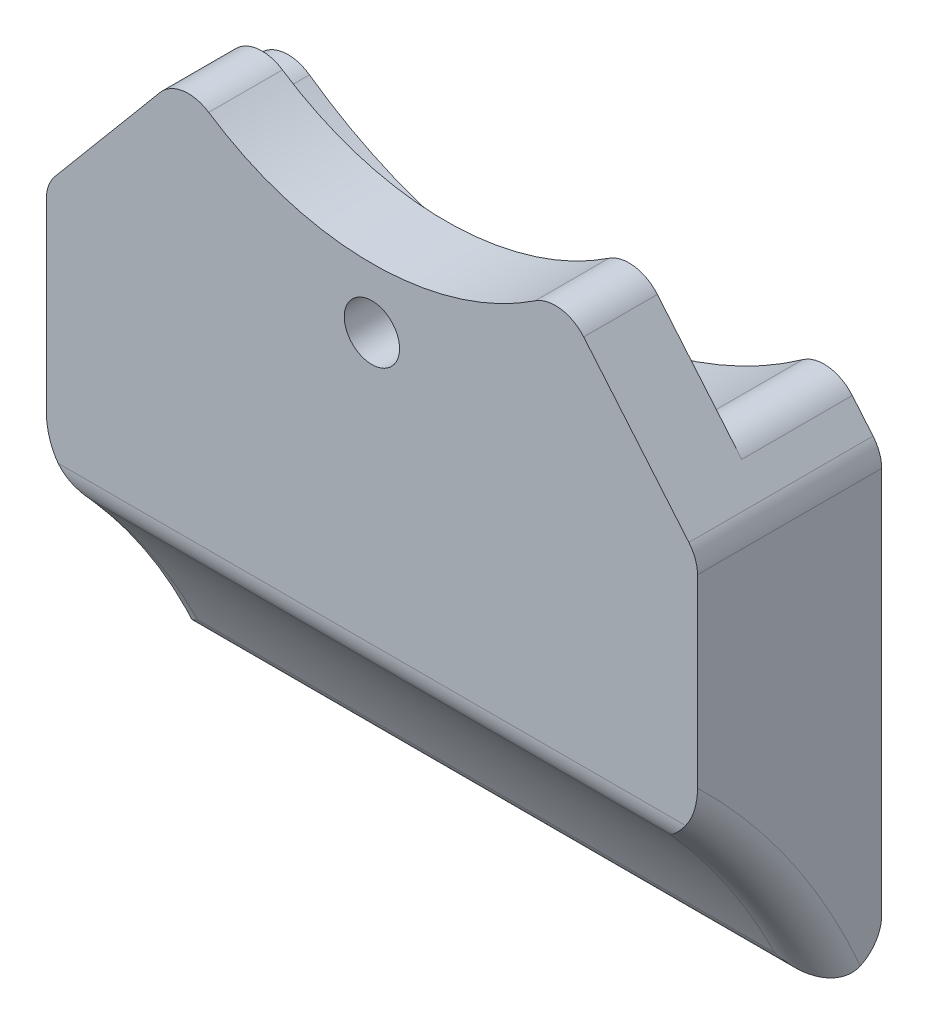
ISO-10303-21;
HEADER;
FILE_DESCRIPTION(('STEP AP214'),'2;1');
FILE_NAME('part.step','',(''),(''),'','','');
FILE_SCHEMA(('AUTOMOTIVE_DESIGN { 1 0 10303 214 1 1 1 1 }'));
ENDSEC;
DATA;
#1=APPLICATION_CONTEXT('core data for automotive mechanical design processes');
#2=APPLICATION_PROTOCOL_DEFINITION('international standard','automotive_design',2000,#1);
#3=PRODUCT_CONTEXT('',#1,'mechanical');
#4=PRODUCT('Part','Part','',(#3));
#5=PRODUCT_RELATED_PRODUCT_CATEGORY('part','',(#4));
#6=PRODUCT_DEFINITION_FORMATION('','',#4);
#7=PRODUCT_DEFINITION_CONTEXT('part definition',#1,'design');
#8=PRODUCT_DEFINITION('design','',#6,#7);
#9=PRODUCT_DEFINITION_SHAPE('','',#8);
#10=(LENGTH_UNIT() NAMED_UNIT(*) SI_UNIT(.MILLI.,.METRE.));
#11=(NAMED_UNIT(*) PLANE_ANGLE_UNIT() SI_UNIT($,.RADIAN.));
#12=(NAMED_UNIT(*) SI_UNIT($,.STERADIAN.) SOLID_ANGLE_UNIT());
#13=UNCERTAINTY_MEASURE_WITH_UNIT(LENGTH_MEASURE(1.E-05),#10,'distance_accuracy_value','');
#14=(GEOMETRIC_REPRESENTATION_CONTEXT(3) GLOBAL_UNCERTAINTY_ASSIGNED_CONTEXT((#13)) GLOBAL_UNIT_ASSIGNED_CONTEXT((#10,
#11,#12)) REPRESENTATION_CONTEXT('',''));
#15=CARTESIAN_POINT('',(0.,0.,0.));
#16=DIRECTION('',(0.,0.,1.));
#17=DIRECTION('',(1.,0.,0.));
#18=AXIS2_PLACEMENT_3D('',#15,#16,#17);
#19=CARTESIAN_POINT('',(0.,0.,4.));
#20=DIRECTION('',(0.,0.,1.));
#21=DIRECTION('',(1.,0.,0.));
#22=AXIS2_PLACEMENT_3D('',#19,#20,#21);
#23=PLANE('',#22);
#24=CARTESIAN_POINT('',(0.,-19.25,4.));
#25=DIRECTION('',(0.,0.,1.));
#26=DIRECTION('',(1.,0.,0.));
#27=AXIS2_PLACEMENT_3D('',#24,#25,#26);
#28=CIRCLE('',#27,1.5);
#29=CARTESIAN_POINT('',(1.5,-19.25,4.));
#30=VERTEX_POINT('',#29);
#31=EDGE_CURVE('E319',#30,#30,#28,.T.);
#32=ORIENTED_EDGE('',*,*,#31,.F.);
#33=EDGE_LOOP('',(#32));
#34=FACE_BOUND('',#33,.T.);
#35=DIRECTION('',(0.,-1.,0.));
#36=VECTOR('',#35,1.);
#37=CARTESIAN_POINT('',(-17.6766592663799,0.,4.));
#38=LINE('',#37,#36);
#39=CARTESIAN_POINT('',(-17.6766592663799,-21.7941626543043,4.));
#40=VERTEX_POINT('',#39);
#41=CARTESIAN_POINT('',(-17.6766592663799,-31.8243825233945,4.));
#42=VERTEX_POINT('',#41);
#43=EDGE_CURVE('E322',#40,#42,#38,.T.);
#44=ORIENTED_EDGE('',*,*,#43,.T.);
#45=CARTESIAN_POINT('',(-17.6766592663799,-31.8243825233945,3.9999999999967));
#46=CARTESIAN_POINT('',(-17.6766357694272,-31.9343749640385,3.99999999999882));
#47=CARTESIAN_POINT('',(-17.6719857055974,-32.044369313297,3.99999999999968));
#48=CARTESIAN_POINT('',(-17.6534181617415,-32.2636584120192,4.00000000000032));
#49=CARTESIAN_POINT('',(-17.6394934580579,-32.3729525490718,4.00000000000008));
#50=CARTESIAN_POINT('',(-17.6028944829724,-32.5868538396903,3.99999999999992));
#51=CARTESIAN_POINT('',(-17.5804824289848,-32.6915055456514,3.99999999999998));
#52=CARTESIAN_POINT('',(-17.5267623417417,-32.8984431423133,4.00000000000002));
#53=CARTESIAN_POINT('',(-17.4954575258458,-33.0007298742037,4.00000000000001));
#54=CARTESIAN_POINT('',(-17.4086733534096,-33.2440915493844,3.99999999999999));
#55=CARTESIAN_POINT('',(-17.3485556770077,-33.3835813057156,4.));
#56=CARTESIAN_POINT('',(-17.2429914051374,-33.5864864514164,4.));
#57=CARTESIAN_POINT('',(-17.2047690246025,-33.6537158392581,4.));
#58=CARTESIAN_POINT('',(-17.1229491682289,-33.7849313597896,4.));
#59=CARTESIAN_POINT('',(-17.0793448537376,-33.8489132172721,4.));
#60=CARTESIAN_POINT('',(-17.0329566766519,-33.9109062876727,4.));
#61=B_SPLINE_CURVE_WITH_KNOTS('',3,(#45,#46,#47,#48,#49,#50,#51,#52,#53,#54,#55,#56,#57,#58,#59,
#60),.UNSPECIFIED.,.F.,.F.,(4,2,2,2,2,2,2,4),(0.,0.329883852276478,0.660024939223467,
0.980703590886416,1.30126636995863,1.75531983697143,1.98710490826723,2.21918759359947),.UNSPECIFIED.);
#62=CARTESIAN_POINT('',(-17.0329566766519,-33.9109062876727,4.));
#63=VERTEX_POINT('',#62);
#64=EDGE_CURVE('E324',#42,#63,#61,.T.);
#65=ORIENTED_EDGE('',*,*,#64,.T.);
#66=DIRECTION('',(1.,0.,0.));
#67=VECTOR('',#66,1.);
#68=CARTESIAN_POINT('',(0.,-33.9109062876727,4.));
#69=LINE('',#68,#67);
#70=CARTESIAN_POINT('',(17.0329566766519,-33.9109062876727,4.));
#71=VERTEX_POINT('',#70);
#72=EDGE_CURVE('E251',#63,#71,#69,.T.);
#73=ORIENTED_EDGE('',*,*,#72,.T.);
#74=CARTESIAN_POINT('',(17.0329566766519,-33.9109062876727,4.));
#75=CARTESIAN_POINT('',(17.0845093536857,-33.8420013231187,4.));
#76=CARTESIAN_POINT('',(17.1326409973879,-33.7706270908203,4.));
#77=CARTESIAN_POINT('',(17.2222710651447,-33.6239635874553,4.));
#78=CARTESIAN_POINT('',(17.2637793236831,-33.5486803450531,4.));
#79=CARTESIAN_POINT('',(17.3396784610586,-33.3967040273244,4.));
#80=CARTESIAN_POINT('',(17.3742060651599,-33.3200786135025,4.));
#81=CARTESIAN_POINT('',(17.4374947515486,-33.164450068212,4.));
#82=CARTESIAN_POINT('',(17.4662531106879,-33.0854458340529,4.));
#83=CARTESIAN_POINT('',(17.5226934271444,-32.9116496201133,4.));
#84=CARTESIAN_POINT('',(17.5493093345438,-32.8165110506859,4.));
#85=CARTESIAN_POINT('',(17.5949842950883,-32.6244420759596,4.));
#86=CARTESIAN_POINT('',(17.6140427902577,-32.5275115389096,4.));
#87=CARTESIAN_POINT('',(17.6451182521384,-32.3298634161594,4.));
#88=CARTESIAN_POINT('',(17.6569326118299,-32.2291139928984,4.));
#89=CARTESIAN_POINT('',(17.6726936734146,-32.0270359641118,4.));
#90=CARTESIAN_POINT('',(17.6766430804498,-31.9257075697526,4.));
#91=CARTESIAN_POINT('',(17.6766592663799,-31.8243825233913,4.));
#92=B_SPLINE_CURVE_WITH_KNOTS('',3,(#74,#75,#76,#77,#78,#79,#80,#81,#82,#83,#84,#85,#86,#87,#88,
#89,#90,#91),.UNSPECIFIED.,.F.,.F.,(4,2,2,2,2,2,2,2,4),(0.,0.257959136537463,0.515531614611769,
0.767426156036738,1.01943931619064,1.31548585351966,1.61155424436685,1.91556481280451,
2.21947079906725),.UNSPECIFIED.);
#93=CARTESIAN_POINT('',(17.6766592663799,-31.8243825233913,4.));
#94=VERTEX_POINT('',#93);
#95=EDGE_CURVE('E243',#71,#94,#92,.T.);
#96=ORIENTED_EDGE('',*,*,#95,.T.);
#97=DIRECTION('',(0.,1.,0.));
#98=VECTOR('',#97,1.);
#99=CARTESIAN_POINT('',(17.6766592663799,0.,4.));
#100=LINE('',#99,#98);
#101=CARTESIAN_POINT('',(17.6766592663799,-21.7941626543043,4.));
#102=VERTEX_POINT('',#101);
#103=EDGE_CURVE('E330',#94,#102,#100,.T.);
#104=ORIENTED_EDGE('',*,*,#103,.T.);
#105=CARTESIAN_POINT('',(15.6766592663799,-21.7941626543043,4.));
#106=DIRECTION('',(0.,0.,1.));
#107=DIRECTION('',(1.,0.,0.));
#108=AXIS2_PLACEMENT_3D('',#105,#106,#107);
#109=CIRCLE('',#108,2.);
#110=CARTESIAN_POINT('',(17.2087481526178,-20.5085874349312,4.));
#111=VERTEX_POINT('',#110);
#112=EDGE_CURVE('E237',#102,#111,#109,.T.);
#113=ORIENTED_EDGE('',*,*,#112,.T.);
#114=DIRECTION('',(0.642787609686541,-0.766044443118977,0.));
#115=VECTOR('',#114,1.);
#116=CARTESIAN_POINT('',(0.,0.,4.));
#117=LINE('',#116,#115);
#118=CARTESIAN_POINT('',(11.4985343228297,-13.7034195888,4.));
#119=VERTEX_POINT('',#118);
#120=EDGE_CURVE('E202',#119,#111,#117,.T.);
#121=ORIENTED_EDGE('',*,*,#120,.F.);
#122=CARTESIAN_POINT('',(9.9664454365917,-14.9889948081731,4.));
#123=DIRECTION('',(0.,0.,1.));
#124=DIRECTION('',(1.,0.,0.));
#125=AXIS2_PLACEMENT_3D('',#122,#123,#124);
#126=CIRCLE('',#125,2.);
#127=CARTESIAN_POINT('',(8.85906261030373,-13.3235509405983,4.));
#128=VERTEX_POINT('',#127);
#129=EDGE_CURVE('E239',#119,#128,#126,.T.);
#130=ORIENTED_EDGE('',*,*,#129,.T.);
#131=CARTESIAN_POINT('',(0.,0.,4.));
#132=DIRECTION('',(0.,0.,1.));
#133=DIRECTION('',(1.,0.,0.));
#134=AXIS2_PLACEMENT_3D('',#131,#132,#133);
#135=CIRCLE('',#134,16.);
#136=CARTESIAN_POINT('',(-8.85906261030373,-13.3235509405983,4.));
#137=VERTEX_POINT('',#136);
#138=EDGE_CURVE('E402',#137,#128,#135,.T.);
#139=ORIENTED_EDGE('',*,*,#138,.F.);
#140=CARTESIAN_POINT('',(-9.9664454365917,-14.9889948081731,4.));
#141=DIRECTION('',(0.,0.,1.));
#142=DIRECTION('',(1.,0.,0.));
#143=AXIS2_PLACEMENT_3D('',#140,#141,#142);
#144=CIRCLE('',#143,2.);
#145=CARTESIAN_POINT('',(-11.4985343228297,-13.7034195888,4.));
#146=VERTEX_POINT('',#145);
#147=EDGE_CURVE('E235',#137,#146,#144,.T.);
#148=ORIENTED_EDGE('',*,*,#147,.T.);
#149=DIRECTION('',(-0.64278760968654,-0.766044443118977,0.));
#150=VECTOR('',#149,1.);
#151=CARTESIAN_POINT('',(0.,0.,4.));
#152=LINE('',#151,#150);
#153=CARTESIAN_POINT('',(-17.2087481526178,-20.5085874349312,4.));
#154=VERTEX_POINT('',#153);
#155=EDGE_CURVE('E405',#146,#154,#152,.T.);
#156=ORIENTED_EDGE('',*,*,#155,.T.);
#157=CARTESIAN_POINT('',(-15.6766592663799,-21.7941626543043,4.));
#158=DIRECTION('',(0.,0.,1.));
#159=DIRECTION('',(1.,0.,0.));
#160=AXIS2_PLACEMENT_3D('',#157,#158,#159);
#161=CIRCLE('',#160,2.);
#162=EDGE_CURVE('E241',#154,#40,#161,.T.);
#163=ORIENTED_EDGE('',*,*,#162,.T.);
#164=EDGE_LOOP('',(#44,#65,#73,#96,#104,#113,#121,#130,#139,#148,#156,#163));
#165=FACE_BOUND('',#164,.T.);
#166=ADVANCED_FACE('F45',(#34,#165),#23,.T.);
#167=CARTESIAN_POINT('',(0.,0.,-6.));
#168=DIRECTION('',(0.,0.,1.));
#169=DIRECTION('',(1.,0.,0.));
#170=AXIS2_PLACEMENT_3D('',#167,#168,#169);
#171=PLANE('',#170);
#172=DIRECTION('',(0.,1.,0.));
#173=VECTOR('',#172,1.);
#174=CARTESIAN_POINT('',(17.6766592663799,0.,-6.));
#175=LINE('',#174,#173);
#176=CARTESIAN_POINT('',(17.6766592663799,-42.7949556585014,-6.));
#177=VERTEX_POINT('',#176);
#178=CARTESIAN_POINT('',(17.6766592663799,-21.7941626543043,-6.));
#179=VERTEX_POINT('',#178);
#180=EDGE_CURVE('E329',#177,#179,#175,.T.);
#181=ORIENTED_EDGE('',*,*,#180,.F.);
#182=DIRECTION('',(-1.,0.,0.));
#183=VECTOR('',#182,1.);
#184=CARTESIAN_POINT('',(-17.6766592663799,-42.7949556585014,-6.));
#185=LINE('',#184,#183);
#186=CARTESIAN_POINT('',(-17.6766592663799,-42.7949556585014,-6.));
#187=VERTEX_POINT('',#186);
#188=EDGE_CURVE('E226',#177,#187,#185,.T.);
#189=ORIENTED_EDGE('',*,*,#188,.T.);
#190=DIRECTION('',(0.,-1.,0.));
#191=VECTOR('',#190,1.);
#192=CARTESIAN_POINT('',(-17.6766592663799,0.,-6.));
#193=LINE('',#192,#191);
#194=CARTESIAN_POINT('',(-17.6766592663799,-21.7941626543043,-6.));
#195=VERTEX_POINT('',#194);
#196=EDGE_CURVE('E398',#195,#187,#193,.T.);
#197=ORIENTED_EDGE('',*,*,#196,.F.);
#198=CARTESIAN_POINT('',(-15.6766592663799,-21.7941626543043,-6.));
#199=DIRECTION('',(0.,0.,1.));
#200=DIRECTION('',(1.,0.,0.));
#201=AXIS2_PLACEMENT_3D('',#198,#199,#200);
#202=CIRCLE('',#201,2.);
#203=CARTESIAN_POINT('',(-17.2087481526178,-20.5085874349312,-6.));
#204=VERTEX_POINT('',#203);
#205=EDGE_CURVE('E220',#195,#204,#202,.F.);
#206=ORIENTED_EDGE('',*,*,#205,.T.);
#207=DIRECTION('',(-0.642787609686541,-0.766044443118977,0.));
#208=VECTOR('',#207,1.);
#209=CARTESIAN_POINT('',(0.,0.,-6.));
#210=LINE('',#209,#208);
#211=CARTESIAN_POINT('',(-16.0826693104523,-19.1665789292361,-6.));
#212=VERTEX_POINT('',#211);
#213=EDGE_CURVE('E393',#212,#204,#210,.T.);
#214=ORIENTED_EDGE('',*,*,#213,.F.);
#215=CARTESIAN_POINT('',(-14.5505804242143,-20.4521541486092,-6.));
#216=DIRECTION('',(0.,0.,1.));
#217=DIRECTION('',(1.,0.,0.));
#218=AXIS2_PLACEMENT_3D('',#215,#216,#217);
#219=CIRCLE('',#218,2.);
#220=CARTESIAN_POINT('',(-13.3911716254721,-18.8225004315885,-6.));
#221=VERTEX_POINT('',#220);
#222=EDGE_CURVE('E222',#212,#221,#219,.F.);
#223=ORIENTED_EDGE('',*,*,#222,.T.);
#224=CARTESIAN_POINT('',(0.,0.,-6.));
#225=DIRECTION('',(0.,0.,1.));
#226=DIRECTION('',(1.,0.,0.));
#227=AXIS2_PLACEMENT_3D('',#224,#225,#226);
#228=CIRCLE('',#227,23.1);
#229=CARTESIAN_POINT('',(13.3911716254721,-18.8225004315885,-6.));
#230=VERTEX_POINT('',#229);
#231=EDGE_CURVE('E388',#221,#230,#228,.T.);
#232=ORIENTED_EDGE('',*,*,#231,.T.);
#233=CARTESIAN_POINT('',(14.5505804242143,-20.4521541486092,-6.));
#234=DIRECTION('',(0.,0.,1.));
#235=DIRECTION('',(1.,0.,0.));
#236=AXIS2_PLACEMENT_3D('',#233,#234,#235);
#237=CIRCLE('',#236,2.);
#238=CARTESIAN_POINT('',(16.0826693104523,-19.1665789292361,-6.));
#239=VERTEX_POINT('',#238);
#240=EDGE_CURVE('E224',#230,#239,#237,.F.);
#241=ORIENTED_EDGE('',*,*,#240,.T.);
#242=DIRECTION('',(0.64278760968654,-0.766044443118978,0.));
#243=VECTOR('',#242,1.);
#244=CARTESIAN_POINT('',(0.,0.,-6.));
#245=LINE('',#244,#243);
#246=CARTESIAN_POINT('',(17.2087481526178,-20.5085874349312,-6.));
#247=VERTEX_POINT('',#246);
#248=EDGE_CURVE('E387',#239,#247,#245,.T.);
#249=ORIENTED_EDGE('',*,*,#248,.T.);
#250=CARTESIAN_POINT('',(15.6766592663799,-21.7941626543043,-6.));
#251=DIRECTION('',(0.,0.,1.));
#252=DIRECTION('',(1.,0.,0.));
#253=AXIS2_PLACEMENT_3D('',#250,#251,#252);
#254=CIRCLE('',#253,2.);
#255=EDGE_CURVE('E218',#247,#179,#254,.F.);
#256=ORIENTED_EDGE('',*,*,#255,.T.);
#257=EDGE_LOOP('',(#181,#189,#197,#206,#214,#223,#232,#241,#249,#256));
#258=FACE_BOUND('',#257,.T.);
#259=ADVANCED_FACE('F307',(#258),#171,.F.);
#260=CARTESIAN_POINT('',(-17.6766592663799,0.,-6.));
#261=DIRECTION('',(-1.,0.,0.));
#262=DIRECTION('',(0.,-1.,0.));
#263=AXIS2_PLACEMENT_3D('',#260,#261,#262);
#264=PLANE('',#263);
#265=ORIENTED_EDGE('',*,*,#196,.T.);
#266=CARTESIAN_POINT('',(-17.6766592663799,-42.7949556585014,-4.));
#267=DIRECTION('',(-1.,0.,0.));
#268=DIRECTION('',(0.,-1.,0.));
#269=AXIS2_PLACEMENT_3D('',#266,#267,#268);
#270=CIRCLE('',#269,2.);
#271=CARTESIAN_POINT('',(-17.6766592663799,-44.6087894436133,-4.84261913103535));
#272=VERTEX_POINT('',#271);
#273=EDGE_CURVE('E233',#187,#272,#270,.T.);
#274=ORIENTED_EDGE('',*,*,#273,.T.);
#275=CARTESIAN_POINT('',(-17.6766592663799,-60.580414151795,31.9116763248178));
#276=DIRECTION('',(-1.,0.,0.));
#277=DIRECTION('',(0.,-1.,0.));
#278=AXIS2_PLACEMENT_3D('',#275,#276,#277);
#279=CIRCLE('',#278,40.0745683729114);
#280=EDGE_CURVE('E231',#272,#42,#279,.F.);
#281=ORIENTED_EDGE('',*,*,#280,.T.);
#282=ORIENTED_EDGE('',*,*,#43,.F.);
#283=DIRECTION('',(0.,0.,1.));
#284=VECTOR('',#283,1.);
#285=CARTESIAN_POINT('',(-17.6766592663799,-21.7941626543043,-6.));
#286=LINE('',#285,#284);
#287=EDGE_CURVE('E229',#40,#195,#286,.F.);
#288=ORIENTED_EDGE('',*,*,#287,.T.);
#289=EDGE_LOOP('',(#265,#274,#281,#282,#288));
#290=FACE_BOUND('',#289,.T.);
#291=ADVANCED_FACE('F313',(#290),#264,.T.);
#292=CARTESIAN_POINT('',(17.6766592663799,0.,-6.));
#293=DIRECTION('',(1.,0.,0.));
#294=DIRECTION('',(0.,0.,-1.));
#295=AXIS2_PLACEMENT_3D('',#292,#293,#294);
#296=PLANE('',#295);
#297=CARTESIAN_POINT('',(17.6766592663799,-60.580414151795,31.9116763248178));
#298=DIRECTION('',(1.,0.,0.));
#299=DIRECTION('',(0.,0.,-1.));
#300=AXIS2_PLACEMENT_3D('',#297,#298,#299);
#301=CIRCLE('',#300,40.0745683729114);
#302=CARTESIAN_POINT('',(17.6766592663799,-44.6087894436133,-4.84261913103535));
#303=VERTEX_POINT('',#302);
#304=EDGE_CURVE('E211',#94,#303,#301,.F.);
#305=ORIENTED_EDGE('',*,*,#304,.T.);
#306=CARTESIAN_POINT('',(17.6766592663799,-42.7949556585014,-4.));
#307=DIRECTION('',(1.,0.,0.));
#308=DIRECTION('',(0.,0.,-1.));
#309=AXIS2_PLACEMENT_3D('',#306,#307,#308);
#310=CIRCLE('',#309,2.);
#311=EDGE_CURVE('E188',#303,#177,#310,.T.);
#312=ORIENTED_EDGE('',*,*,#311,.T.);
#313=ORIENTED_EDGE('',*,*,#180,.T.);
#314=DIRECTION('',(0.,0.,1.));
#315=VECTOR('',#314,1.);
#316=CARTESIAN_POINT('',(17.6766592663799,-21.7941626543043,-6.));
#317=LINE('',#316,#315);
#318=EDGE_CURVE('E208',#179,#102,#317,.T.);
#319=ORIENTED_EDGE('',*,*,#318,.T.);
#320=ORIENTED_EDGE('',*,*,#103,.F.);
#321=EDGE_LOOP('',(#305,#312,#313,#319,#320));
#322=FACE_BOUND('',#321,.T.);
#323=ADVANCED_FACE('F424',(#322),#296,.T.);
#324=CARTESIAN_POINT('',(0.,0.,4.));
#325=DIRECTION('',(0.,0.,-1.));
#326=DIRECTION('',(-1.,0.,0.));
#327=AXIS2_PLACEMENT_3D('',#324,#325,#326);
#328=CYLINDRICAL_SURFACE('',#327,16.);
#329=ORIENTED_EDGE('',*,*,#138,.T.);
#330=DIRECTION('',(0.,0.,-1.));
#331=VECTOR('',#330,1.);
#332=CARTESIAN_POINT('',(8.85906261030373,-13.3235509405983,4.));
#333=LINE('',#332,#331);
#334=CARTESIAN_POINT('',(8.85906261030373,-13.3235509405983,0.));
#335=VERTEX_POINT('',#334);
#336=EDGE_CURVE('E363',#128,#335,#333,.T.);
#337=ORIENTED_EDGE('',*,*,#336,.T.);
#338=CARTESIAN_POINT('',(0.,0.,0.));
#339=DIRECTION('',(0.,0.,1.));
#340=DIRECTION('',(1.,0.,0.));
#341=AXIS2_PLACEMENT_3D('',#338,#339,#340);
#342=CIRCLE('',#341,16.);
#343=CARTESIAN_POINT('',(-8.85906261030373,-13.3235509405983,0.));
#344=VERTEX_POINT('',#343);
#345=EDGE_CURVE('E410',#344,#335,#342,.T.);
#346=ORIENTED_EDGE('',*,*,#345,.F.);
#347=DIRECTION('',(0.,0.,-1.));
#348=VECTOR('',#347,1.);
#349=CARTESIAN_POINT('',(-8.85906261030373,-13.3235509405983,4.));
#350=LINE('',#349,#348);
#351=EDGE_CURVE('E361',#344,#137,#350,.F.);
#352=ORIENTED_EDGE('',*,*,#351,.T.);
#353=EDGE_LOOP('',(#329,#337,#346,#352));
#354=FACE_BOUND('',#353,.T.);
#355=ADVANCED_FACE('F427',(#354),#328,.F.);
#356=CARTESIAN_POINT('',(0.,0.,4.));
#357=DIRECTION('',(0.766044443118977,-0.642787609686541,0.));
#358=DIRECTION('',(0.642787609686541,0.766044443118977,0.));
#359=AXIS2_PLACEMENT_3D('',#356,#357,#358);
#360=PLANE('',#359);
#361=DIRECTION('',(-0.64278760968654,-0.766044443118977,0.));
#362=VECTOR('',#361,1.);
#363=CARTESIAN_POINT('',(0.,0.,0.));
#364=LINE('',#363,#362);
#365=CARTESIAN_POINT('',(-11.4985343228297,-13.7034195888,0.));
#366=VERTEX_POINT('',#365);
#367=CARTESIAN_POINT('',(-16.0826693104523,-19.1665789292361,0.));
#368=VERTEX_POINT('',#367);
#369=EDGE_CURVE('E381',#366,#368,#364,.T.);
#370=ORIENTED_EDGE('',*,*,#369,.T.);
#371=DIRECTION('',(0.,0.,1.));
#372=VECTOR('',#371,1.);
#373=CARTESIAN_POINT('',(-16.0826693104523,-19.1665789292361,4.));
#374=LINE('',#373,#372);
#375=EDGE_CURVE('E359',#368,#212,#374,.F.);
#376=ORIENTED_EDGE('',*,*,#375,.T.);
#377=ORIENTED_EDGE('',*,*,#213,.T.);
#378=DIRECTION('',(0.,0.,1.));
#379=VECTOR('',#378,1.);
#380=CARTESIAN_POINT('',(-17.2087481526178,-20.5085874349312,4.));
#381=LINE('',#380,#379);
#382=EDGE_CURVE('E356',#204,#154,#381,.T.);
#383=ORIENTED_EDGE('',*,*,#382,.T.);
#384=ORIENTED_EDGE('',*,*,#155,.F.);
#385=DIRECTION('',(0.,0.,1.));
#386=VECTOR('',#385,1.);
#387=CARTESIAN_POINT('',(-11.4985343228297,-13.7034195888,0.));
#388=LINE('',#387,#386);
#389=EDGE_CURVE('E353',#146,#366,#388,.F.);
#390=ORIENTED_EDGE('',*,*,#389,.T.);
#391=EDGE_LOOP('',(#370,#376,#377,#383,#384,#390));
#392=FACE_BOUND('',#391,.T.);
#393=ADVANCED_FACE('F434',(#392),#360,.F.);
#394=CARTESIAN_POINT('',(0.,-19.25,4.));
#395=DIRECTION('',(0.,0.,-1.));
#396=DIRECTION('',(-1.,0.,0.));
#397=AXIS2_PLACEMENT_3D('',#394,#395,#396);
#398=CYLINDRICAL_SURFACE('',#397,1.5);
#399=ORIENTED_EDGE('',*,*,#31,.T.);
#400=EDGE_LOOP('',(#399));
#401=FACE_BOUND('',#400,.T.);
#402=CARTESIAN_POINT('',(0.,-19.25,0.));
#403=DIRECTION('',(0.,0.,1.));
#404=DIRECTION('',(1.,0.,0.));
#405=AXIS2_PLACEMENT_3D('',#402,#403,#404);
#406=CIRCLE('',#405,1.5);
#407=CARTESIAN_POINT('',(1.5,-19.25,0.));
#408=VERTEX_POINT('',#407);
#409=EDGE_CURVE('E395',#408,#408,#406,.T.);
#410=ORIENTED_EDGE('',*,*,#409,.F.);
#411=EDGE_LOOP('',(#410));
#412=FACE_BOUND('',#411,.T.);
#413=ADVANCED_FACE('F447',(#401,#412),#398,.F.);
#414=CARTESIAN_POINT('',(0.,0.,4.));
#415=DIRECTION('',(0.766044443118977,0.642787609686541,0.));
#416=DIRECTION('',(-0.642787609686541,0.766044443118977,0.));
#417=AXIS2_PLACEMENT_3D('',#414,#415,#416);
#418=PLANE('',#417);
#419=ORIENTED_EDGE('',*,*,#248,.F.);
#420=DIRECTION('',(0.,0.,-1.));
#421=VECTOR('',#420,1.);
#422=CARTESIAN_POINT('',(16.0826693104523,-19.1665789292361,0.));
#423=LINE('',#422,#421);
#424=CARTESIAN_POINT('',(16.0826693104523,-19.1665789292361,0.));
#425=VERTEX_POINT('',#424);
#426=EDGE_CURVE('E345',#239,#425,#423,.F.);
#427=ORIENTED_EDGE('',*,*,#426,.T.);
#428=DIRECTION('',(0.642787609686541,-0.766044443118977,0.));
#429=VECTOR('',#428,1.);
#430=CARTESIAN_POINT('',(0.,0.,0.));
#431=LINE('',#430,#429);
#432=CARTESIAN_POINT('',(11.4985343228297,-13.7034195888,0.));
#433=VERTEX_POINT('',#432);
#434=EDGE_CURVE('E373',#433,#425,#431,.T.);
#435=ORIENTED_EDGE('',*,*,#434,.F.);
#436=DIRECTION('',(0.,0.,-1.));
#437=VECTOR('',#436,1.);
#438=CARTESIAN_POINT('',(11.4985343228297,-13.7034195888,4.));
#439=LINE('',#438,#437);
#440=EDGE_CURVE('E337',#433,#119,#439,.F.);
#441=ORIENTED_EDGE('',*,*,#440,.T.);
#442=ORIENTED_EDGE('',*,*,#120,.T.);
#443=DIRECTION('',(0.,0.,1.));
#444=VECTOR('',#443,1.);
#445=CARTESIAN_POINT('',(17.2087481526178,-20.5085874349312,4.));
#446=LINE('',#445,#444);
#447=EDGE_CURVE('E336',#111,#247,#446,.F.);
#448=ORIENTED_EDGE('',*,*,#447,.T.);
#449=EDGE_LOOP('',(#419,#427,#435,#441,#442,#448));
#450=FACE_BOUND('',#449,.T.);
#451=ADVANCED_FACE('F390',(#450),#418,.T.);
#452=CARTESIAN_POINT('',(0.,0.,0.));
#453=DIRECTION('',(0.,0.,1.));
#454=DIRECTION('',(1.,0.,0.));
#455=AXIS2_PLACEMENT_3D('',#452,#453,#454);
#456=PLANE('',#455);
#457=ORIENTED_EDGE('',*,*,#409,.T.);
#458=EDGE_LOOP('',(#457));
#459=FACE_BOUND('',#458,.T.);
#460=ORIENTED_EDGE('',*,*,#345,.T.);
#461=CARTESIAN_POINT('',(9.9664454365917,-14.9889948081731,0.));
#462=DIRECTION('',(0.,0.,1.));
#463=DIRECTION('',(1.,0.,0.));
#464=AXIS2_PLACEMENT_3D('',#461,#462,#463);
#465=CIRCLE('',#464,2.);
#466=EDGE_CURVE('E68',#335,#433,#465,.F.);
#467=ORIENTED_EDGE('',*,*,#466,.T.);
#468=ORIENTED_EDGE('',*,*,#434,.T.);
#469=CARTESIAN_POINT('',(14.5505804242143,-20.4521541486092,0.));
#470=DIRECTION('',(0.,0.,1.));
#471=DIRECTION('',(1.,0.,0.));
#472=AXIS2_PLACEMENT_3D('',#469,#470,#471);
#473=CIRCLE('',#472,2.);
#474=CARTESIAN_POINT('',(13.3911716254721,-18.8225004315885,0.));
#475=VERTEX_POINT('',#474);
#476=EDGE_CURVE('E60',#425,#475,#473,.T.);
#477=ORIENTED_EDGE('',*,*,#476,.T.);
#478=CARTESIAN_POINT('',(0.,0.,0.));
#479=DIRECTION('',(0.,0.,1.));
#480=DIRECTION('',(1.,0.,0.));
#481=AXIS2_PLACEMENT_3D('',#478,#479,#480);
#482=CIRCLE('',#481,23.1);
#483=CARTESIAN_POINT('',(-13.3911716254721,-18.8225004315885,0.));
#484=VERTEX_POINT('',#483);
#485=EDGE_CURVE('E371',#484,#475,#482,.T.);
#486=ORIENTED_EDGE('',*,*,#485,.F.);
#487=CARTESIAN_POINT('',(-14.5505804242143,-20.4521541486092,0.));
#488=DIRECTION('',(0.,0.,1.));
#489=DIRECTION('',(1.,0.,0.));
#490=AXIS2_PLACEMENT_3D('',#487,#488,#489);
#491=CIRCLE('',#490,2.);
#492=EDGE_CURVE('E11',#484,#368,#491,.T.);
#493=ORIENTED_EDGE('',*,*,#492,.T.);
#494=ORIENTED_EDGE('',*,*,#369,.F.);
#495=CARTESIAN_POINT('',(-9.9664454365917,-14.9889948081731,0.));
#496=DIRECTION('',(0.,0.,1.));
#497=DIRECTION('',(1.,0.,0.));
#498=AXIS2_PLACEMENT_3D('',#495,#496,#497);
#499=CIRCLE('',#498,2.);
#500=EDGE_CURVE('E76',#366,#344,#499,.F.);
#501=ORIENTED_EDGE('',*,*,#500,.T.);
#502=EDGE_LOOP('',(#460,#467,#468,#477,#486,#493,#494,#501));
#503=FACE_BOUND('',#502,.T.);
#504=ADVANCED_FACE('F370',(#459,#503),#456,.F.);
#505=CARTESIAN_POINT('',(0.,0.,-6.));
#506=DIRECTION('',(0.,0.,1.));
#507=DIRECTION('',(1.,0.,0.));
#508=AXIS2_PLACEMENT_3D('',#505,#506,#507);
#509=CYLINDRICAL_SURFACE('',#508,23.1);
#510=ORIENTED_EDGE('',*,*,#485,.T.);
#511=DIRECTION('',(0.,0.,1.));
#512=VECTOR('',#511,1.);
#513=CARTESIAN_POINT('',(13.3911716254721,-18.8225004315885,-6.));
#514=LINE('',#513,#512);
#515=EDGE_CURVE('E351',#475,#230,#514,.F.);
#516=ORIENTED_EDGE('',*,*,#515,.T.);
#517=ORIENTED_EDGE('',*,*,#231,.F.);
#518=DIRECTION('',(0.,0.,1.));
#519=VECTOR('',#518,1.);
#520=CARTESIAN_POINT('',(-13.3911716254721,-18.8225004315885,-6.));
#521=LINE('',#520,#519);
#522=EDGE_CURVE('E348',#221,#484,#521,.T.);
#523=ORIENTED_EDGE('',*,*,#522,.T.);
#524=EDGE_LOOP('',(#510,#516,#517,#523));
#525=FACE_BOUND('',#524,.T.);
#526=ADVANCED_FACE('F377',(#525),#509,.F.);
#527=CARTESIAN_POINT('',(-17.6766592663799,-60.580414151795,31.9116763248178));
#528=DIRECTION('',(1.,0.,0.));
#529=DIRECTION('',(0.,0.,-1.));
#530=AXIS2_PLACEMENT_3D('',#527,#528,#529);
#531=CYLINDRICAL_SURFACE('',#530,38.0745683729114);
#532=CARTESIAN_POINT('',(-15.6766592663799,-60.580414151795,31.9116763248178));
#533=DIRECTION('',(-1.,0.,0.));
#534=DIRECTION('',(0.,-1.,0.));
#535=AXIS2_PLACEMENT_3D('',#532,#533,#534);
#536=CIRCLE('',#535,38.0745683729114);
#537=CARTESIAN_POINT('',(-15.6766592663799,-35.2419004291916,3.49280092284347));
#538=VERTEX_POINT('',#537);
#539=CARTESIAN_POINT('',(-15.6766592663799,-43.6825738770081,-2.20775729931043));
#540=VERTEX_POINT('',#539);
#541=EDGE_CURVE('E206',#538,#540,#536,.T.);
#542=ORIENTED_EDGE('',*,*,#541,.T.);
#543=DIRECTION('',(1.,0.,0.));
#544=VECTOR('',#543,1.);
#545=CARTESIAN_POINT('',(-17.6766592663799,-43.6825738770081,-2.20775729931043));
#546=LINE('',#545,#544);
#547=CARTESIAN_POINT('',(15.6766592663799,-43.6825738770081,-2.20775729931043));
#548=VERTEX_POINT('',#547);
#549=EDGE_CURVE('E186',#540,#548,#546,.T.);
#550=ORIENTED_EDGE('',*,*,#549,.T.);
#551=CARTESIAN_POINT('',(15.6766592663799,-60.580414151795,31.9116763248178));
#552=DIRECTION('',(1.,0.,0.));
#553=DIRECTION('',(0.,0.,-1.));
#554=AXIS2_PLACEMENT_3D('',#551,#552,#553);
#555=CIRCLE('',#554,38.0745683729114);
#556=CARTESIAN_POINT('',(15.6766592663799,-35.2419004291916,3.49280092284347));
#557=VERTEX_POINT('',#556);
#558=EDGE_CURVE('E194',#548,#557,#555,.T.);
#559=ORIENTED_EDGE('',*,*,#558,.T.);
#560=DIRECTION('',(1.,0.,0.));
#561=VECTOR('',#560,1.);
#562=CARTESIAN_POINT('',(-17.6766592663799,-35.2419004291916,3.49280092284347));
#563=LINE('',#562,#561);
#564=EDGE_CURVE('E201',#557,#538,#563,.F.);
#565=ORIENTED_EDGE('',*,*,#564,.T.);
#566=EDGE_LOOP('',(#542,#550,#559,#565));
#567=FACE_BOUND('',#566,.T.);
#568=ADVANCED_FACE('F204',(#567),#531,.F.);
#569=CARTESIAN_POINT('',(-17.6766592663799,-33.9109062876727,2.));
#570=DIRECTION('',(1.,0.,0.));
#571=DIRECTION('',(0.,0.,-1.));
#572=AXIS2_PLACEMENT_3D('',#569,#570,#571);
#573=CYLINDRICAL_SURFACE('',#572,2.);
#574=CARTESIAN_POINT('',(17.0329566766519,-33.9109062876727,4.));
#575=CARTESIAN_POINT('',(16.9819640204519,-33.979000487723,3.99998075475754));
#576=CARTESIAN_POINT('',(16.9294278459278,-34.0458579453353,3.99652349799343));
#577=CARTESIAN_POINT('',(16.8219229836336,-34.1768248725369,3.98333868734233));
#578=CARTESIAN_POINT('',(16.7669572787304,-34.2409375315001,3.97361863382898));
#579=CARTESIAN_POINT('',(16.6552609633786,-34.3661495932558,3.94854198606923));
#580=CARTESIAN_POINT('',(16.5985350368207,-34.4272560333864,3.93319934332271));
#581=CARTESIAN_POINT('',(16.4836229360244,-34.5465162769641,3.89733440136057));
#582=CARTESIAN_POINT('',(16.4254363327684,-34.6046691974014,3.87681056395262));
#583=CARTESIAN_POINT('',(16.2552325015562,-34.768786660127,3.81038709838553));
#584=CARTESIAN_POINT('',(16.1417896000007,-34.8707998769162,3.75824877368953));
#585=CARTESIAN_POINT('',(15.9132222193246,-35.0630555168279,3.63870208899862));
#586=CARTESIAN_POINT('',(15.7980994393709,-35.1533090257803,3.57130827680773));
#587=CARTESIAN_POINT('',(15.6809292160872,-35.2387917176287,3.49556831629611));
#588=CARTESIAN_POINT('',(15.6787942230138,-35.2403471649681,3.49418581716326));
#589=CARTESIAN_POINT('',(15.6766592663799,-35.2419004291916,3.49280092284346));
#590=B_SPLINE_CURVE_WITH_KNOTS('',3,(#574,#575,#576,#577,#578,#579,#580,#581,#582,#583,#584,
#585,#586,#587,#588,#589),.UNSPECIFIED.,.F.,.F.,(4,2,2,2,2,2,2,4),(0.,0.255027271590732,
0.509749686826405,0.763844284540137,1.01801440671677,1.50039075831643,1.98230903393019,
1.99125331114791),.UNSPECIFIED.);
#591=EDGE_CURVE('E198',#71,#557,#590,.T.);
#592=ORIENTED_EDGE('',*,*,#591,.F.);
#593=ORIENTED_EDGE('',*,*,#72,.F.);
#594=CARTESIAN_POINT('',(-17.0329566766519,-33.9109062876727,4.));
#595=CARTESIAN_POINT('',(-16.9819640204519,-33.979000487723,3.99998075475754));
#596=CARTESIAN_POINT('',(-16.9294278459278,-34.0458579453353,3.99652349799343));
#597=CARTESIAN_POINT('',(-16.8219229836336,-34.1768248725369,3.98333868734232));
#598=CARTESIAN_POINT('',(-16.7669572787304,-34.2409375315002,3.97361863382897));
#599=CARTESIAN_POINT('',(-16.6552609633785,-34.3661495932559,3.94854198606923));
#600=CARTESIAN_POINT('',(-16.5985350368207,-34.4272560333864,3.93319934332272));
#601=CARTESIAN_POINT('',(-16.4836229360244,-34.5465162769641,3.89733440136056));
#602=CARTESIAN_POINT('',(-16.4254363327684,-34.6046691974014,3.87681056395259));
#603=CARTESIAN_POINT('',(-16.2552325015561,-34.768786660127,3.81038709838558));
#604=CARTESIAN_POINT('',(-16.1417896000003,-34.8707998769159,3.75824877368982));
#605=CARTESIAN_POINT('',(-15.913222219325,-35.0630555168282,3.63870208899834));
#606=CARTESIAN_POINT('',(-15.7980994393724,-35.1533090257813,3.57130827680666));
#607=CARTESIAN_POINT('',(-15.6809292160873,-35.2387917176287,3.49556831629608));
#608=CARTESIAN_POINT('',(-15.6787942230138,-35.2403471649681,3.49418581716324));
#609=CARTESIAN_POINT('',(-15.6766592663799,-35.2419004291916,3.49280092284346));
#610=B_SPLINE_CURVE_WITH_KNOTS('',3,(#594,#595,#596,#597,#598,#599,#600,#601,#602,#603,#604,
#605,#606,#607,#608,#609),.UNSPECIFIED.,.F.,.F.,(4,2,2,2,2,2,2,4),(0.,0.255027271590734,
0.509749686826433,0.763844284540155,1.01801440671677,1.50039075831642,1.98230903393018,
1.99125331114791),.UNSPECIFIED.);
#611=EDGE_CURVE('E49',#538,#63,#610,.F.);
#612=ORIENTED_EDGE('',*,*,#611,.F.);
#613=ORIENTED_EDGE('',*,*,#564,.F.);
#614=EDGE_LOOP('',(#592,#593,#612,#613));
#615=FACE_BOUND('',#614,.T.);
#616=ADVANCED_FACE('F278',(#615),#573,.T.);
#617=CARTESIAN_POINT('',(-15.6766592663799,-60.580414151795,31.9116763248178));
#618=DIRECTION('',(-1.,0.,0.));
#619=DIRECTION('',(0.,-1.,0.));
#620=AXIS2_PLACEMENT_3D('',#617,#618,#619);
#621=TOROIDAL_SURFACE('',#620,40.0745683729114,2.);
#622=ORIENTED_EDGE('',*,*,#64,.F.);
#623=ORIENTED_EDGE('',*,*,#280,.F.);
#624=CARTESIAN_POINT('',(-17.6766592663799,-44.6087894436133,-4.84261913103535));
#625=CARTESIAN_POINT('',(-17.6766704807254,-44.6275897275157,-4.80217571988049));
#626=CARTESIAN_POINT('',(-17.6751687573112,-44.6450141197213,-4.76110131301878));
#627=CARTESIAN_POINT('',(-17.6692099586978,-44.6770143946668,-4.67810028624675));
#628=CARTESIAN_POINT('',(-17.6647550434434,-44.6915923491919,-4.63617431087649));
#629=CARTESIAN_POINT('',(-17.6530098678989,-44.7177202507624,-4.55217493714354));
#630=CARTESIAN_POINT('',(-17.6457438027455,-44.7292946655502,-4.5101057541531));
#631=CARTESIAN_POINT('',(-17.6285179607567,-44.7495769145826,-4.42583659055323));
#632=CARTESIAN_POINT('',(-17.6185578432565,-44.7582843859912,-4.3836365940699));
#633=CARTESIAN_POINT('',(-17.5849449650583,-44.7801251250427,-4.2575695994382));
#634=CARTESIAN_POINT('',(-17.557515751111,-44.7890689533465,-4.17393283944521));
#635=CARTESIAN_POINT('',(-17.4942015288548,-44.7966391963519,-4.0093915320425));
#636=CARTESIAN_POINT('',(-17.4582980601941,-44.7952428814316,-3.92849339671756));
#637=CARTESIAN_POINT('',(-17.3636616407711,-44.7809227666871,-3.73862631483883));
#638=CARTESIAN_POINT('',(-17.301588443112,-44.7635321379086,-3.63165669439598));
#639=CARTESIAN_POINT('',(-17.1678685091336,-44.7141691379985,-3.42755139542811));
#640=CARTESIAN_POINT('',(-17.0962026623885,-44.6821673435424,-3.33043604565302));
#641=CARTESIAN_POINT('',(-16.9155524222622,-44.5909758991882,-3.10896894424218));
#642=CARTESIAN_POINT('',(-16.8032795486163,-44.5260203645785,-2.98968987310586));
#643=CARTESIAN_POINT('',(-16.570955755942,-44.3786128408705,-2.77142226670396));
#644=CARTESIAN_POINT('',(-16.4508959749064,-44.2961406650957,-2.67245740310581));
#645=CARTESIAN_POINT('',(-16.2230854455069,-44.1295236852137,-2.5064081946054));
#646=CARTESIAN_POINT('',(-16.1158621426455,-44.0471090215695,-2.43682333871275));
#647=CARTESIAN_POINT('',(-15.9000843682648,-43.8737196871844,-2.31251146978624));
#648=CARTESIAN_POINT('',(-15.7915329783663,-43.7827624175661,-2.25775509903721));
#649=CARTESIAN_POINT('',(-15.6809292141556,-43.6863021207909,-2.20960736324395));
#650=CARTESIAN_POINT('',(-15.678794221005,-43.6844387015251,-2.2086808702675));
#651=CARTESIAN_POINT('',(-15.6766592663799,-43.6825738770081,-2.20775729931042));
#652=B_SPLINE_CURVE_WITH_KNOTS('',3,(#624,#625,#626,#627,#628,#629,#630,#631,#632,#633,#634,
#635,#636,#637,#638,#639,#640,#641,#642,#643,#644,#645,#646,#647,#648,#649,#650,#651),
.UNSPECIFIED.,.F.,.F.,(4,2,2,2,2,2,2,2,2,2,2,2,2,4),(0.,0.133735833075547,0.267373960414522,
0.399886593258733,0.532415990260776,0.796529170984169,1.06122309529691,1.43381153046705,
1.80715359987165,2.33295497574459,2.85936562019822,3.31468268221408,3.76909159691695,
3.77803587413468),.UNSPECIFIED.);
#653=EDGE_CURVE('E191',#540,#272,#652,.F.);
#654=ORIENTED_EDGE('',*,*,#653,.F.);
#655=ORIENTED_EDGE('',*,*,#541,.F.);
#656=ORIENTED_EDGE('',*,*,#611,.T.);
#657=EDGE_LOOP('',(#622,#623,#654,#655,#656));
#658=FACE_BOUND('',#657,.T.);
#659=ADVANCED_FACE('F259',(#658),#621,.T.);
#660=CARTESIAN_POINT('',(15.6766592663799,-60.580414151795,31.9116763248178));
#661=DIRECTION('',(1.,0.,0.));
#662=DIRECTION('',(0.,0.,-1.));
#663=AXIS2_PLACEMENT_3D('',#660,#661,#662);
#664=TOROIDAL_SURFACE('',#663,40.0745683729114,2.);
#665=ORIENTED_EDGE('',*,*,#591,.T.);
#666=ORIENTED_EDGE('',*,*,#558,.F.);
#667=CARTESIAN_POINT('',(17.6766592663799,-44.6087894436133,-4.84261913103535));
#668=CARTESIAN_POINT('',(17.6766704807254,-44.6275897275157,-4.80217571988049));
#669=CARTESIAN_POINT('',(17.6751687573112,-44.6450141197213,-4.76110131301878));
#670=CARTESIAN_POINT('',(17.6692099586978,-44.6770143946668,-4.67810028624675));
#671=CARTESIAN_POINT('',(17.6647550434434,-44.6915923491919,-4.63617431087649));
#672=CARTESIAN_POINT('',(17.6530098678989,-44.7177202507624,-4.55217493714354));
#673=CARTESIAN_POINT('',(17.6457438027455,-44.7292946655502,-4.5101057541531));
#674=CARTESIAN_POINT('',(17.6285179607567,-44.7495769145826,-4.42583659055323));
#675=CARTESIAN_POINT('',(17.6185578432565,-44.7582843859912,-4.3836365940699));
#676=CARTESIAN_POINT('',(17.5849449650583,-44.7801251250427,-4.2575695994382));
#677=CARTESIAN_POINT('',(17.557515751111,-44.7890689533465,-4.17393283944521));
#678=CARTESIAN_POINT('',(17.4942015288548,-44.7966391963519,-4.00939153204251));
#679=CARTESIAN_POINT('',(17.4582980601941,-44.7952428814316,-3.92849339671756));
#680=CARTESIAN_POINT('',(17.3636616407711,-44.7809227666871,-3.73862631483882));
#681=CARTESIAN_POINT('',(17.301588443112,-44.7635321379086,-3.63165669439597));
#682=CARTESIAN_POINT('',(17.1678685091336,-44.7141691379984,-3.4275513954281));
#683=CARTESIAN_POINT('',(17.0962026623885,-44.6821673435423,-3.330436045653));
#684=CARTESIAN_POINT('',(16.9155524222622,-44.5909758991882,-3.10896894424218));
#685=CARTESIAN_POINT('',(16.8032795486162,-44.5260203645785,-2.98968987310589));
#686=CARTESIAN_POINT('',(16.5709557559421,-44.3786128408704,-2.77142226670392));
#687=CARTESIAN_POINT('',(16.4508959749067,-44.2961406650954,-2.67245740310565));
#688=CARTESIAN_POINT('',(16.2230854455066,-44.129523685214,-2.50640819460551));
#689=CARTESIAN_POINT('',(16.1158621426445,-44.0471090215703,-2.43682333871318));
#690=CARTESIAN_POINT('',(15.9000843682657,-43.8737196871835,-2.31251146978582));
#691=CARTESIAN_POINT('',(15.7915329783698,-43.7827624175629,-2.25775509903563));
#692=CARTESIAN_POINT('',(15.6809292141557,-43.6863021207908,-2.20960736324389));
#693=CARTESIAN_POINT('',(15.678794221005,-43.684438701525,-2.20868087026747));
#694=CARTESIAN_POINT('',(15.6766592663799,-43.6825738770081,-2.20775729931043));
#695=B_SPLINE_CURVE_WITH_KNOTS('',3,(#667,#668,#669,#670,#671,#672,#673,#674,#675,#676,#677,
#678,#679,#680,#681,#682,#683,#684,#685,#686,#687,#688,#689,#690,#691,#692,#693,#694),
.UNSPECIFIED.,.F.,.F.,(4,2,2,2,2,2,2,2,2,2,2,2,2,4),(0.,0.133735833075547,0.267373960414523,
0.399886593258732,0.532415990260775,0.796529170984167,1.06122309529691,1.43381153046706,
1.80715359987165,2.33295497574459,2.85936562019824,3.31468268221408,3.76909159691694,
3.77803587413468),.UNSPECIFIED.);
#696=EDGE_CURVE('E181',#303,#548,#695,.T.);
#697=ORIENTED_EDGE('',*,*,#696,.F.);
#698=ORIENTED_EDGE('',*,*,#304,.F.);
#699=ORIENTED_EDGE('',*,*,#95,.F.);
#700=EDGE_LOOP('',(#665,#666,#697,#698,#699));
#701=FACE_BOUND('',#700,.T.);
#702=ADVANCED_FACE('F195',(#701),#664,.T.);
#703=CARTESIAN_POINT('',(-17.6766592663799,-42.7949556585014,-4.));
#704=DIRECTION('',(1.,0.,0.));
#705=DIRECTION('',(0.,0.,-1.));
#706=AXIS2_PLACEMENT_3D('',#703,#704,#705);
#707=CYLINDRICAL_SURFACE('',#706,2.);
#708=ORIENTED_EDGE('',*,*,#273,.F.);
#709=ORIENTED_EDGE('',*,*,#188,.F.);
#710=ORIENTED_EDGE('',*,*,#311,.F.);
#711=ORIENTED_EDGE('',*,*,#696,.T.);
#712=ORIENTED_EDGE('',*,*,#549,.F.);
#713=ORIENTED_EDGE('',*,*,#653,.T.);
#714=EDGE_LOOP('',(#708,#709,#710,#711,#712,#713));
#715=FACE_BOUND('',#714,.T.);
#716=ADVANCED_FACE('F183',(#715),#707,.T.);
#717=CARTESIAN_POINT('',(14.5505804242143,-20.4521541486092,-6.));
#718=DIRECTION('',(0.,0.,1.));
#719=DIRECTION('',(1.,0.,0.));
#720=AXIS2_PLACEMENT_3D('',#717,#718,#719);
#721=CYLINDRICAL_SURFACE('',#720,2.);
#722=ORIENTED_EDGE('',*,*,#240,.F.);
#723=ORIENTED_EDGE('',*,*,#515,.F.);
#724=ORIENTED_EDGE('',*,*,#476,.F.);
#725=ORIENTED_EDGE('',*,*,#426,.F.);
#726=EDGE_LOOP('',(#722,#723,#724,#725));
#727=FACE_BOUND('',#726,.T.);
#728=ADVANCED_FACE('F283',(#727),#721,.T.);
#729=CARTESIAN_POINT('',(-14.5505804242143,-20.4521541486092,-6.));
#730=DIRECTION('',(0.,0.,1.));
#731=DIRECTION('',(1.,0.,0.));
#732=AXIS2_PLACEMENT_3D('',#729,#730,#731);
#733=CYLINDRICAL_SURFACE('',#732,2.);
#734=ORIENTED_EDGE('',*,*,#222,.F.);
#735=ORIENTED_EDGE('',*,*,#375,.F.);
#736=ORIENTED_EDGE('',*,*,#492,.F.);
#737=ORIENTED_EDGE('',*,*,#522,.F.);
#738=EDGE_LOOP('',(#734,#735,#736,#737));
#739=FACE_BOUND('',#738,.T.);
#740=ADVANCED_FACE('F287',(#739),#733,.T.);
#741=CARTESIAN_POINT('',(-15.6766592663799,-21.7941626543043,4.));
#742=DIRECTION('',(0.,0.,-1.));
#743=DIRECTION('',(-1.,0.,0.));
#744=AXIS2_PLACEMENT_3D('',#741,#742,#743);
#745=CYLINDRICAL_SURFACE('',#744,2.);
#746=ORIENTED_EDGE('',*,*,#205,.F.);
#747=ORIENTED_EDGE('',*,*,#287,.F.);
#748=ORIENTED_EDGE('',*,*,#162,.F.);
#749=ORIENTED_EDGE('',*,*,#382,.F.);
#750=EDGE_LOOP('',(#746,#747,#748,#749));
#751=FACE_BOUND('',#750,.T.);
#752=ADVANCED_FACE('F291',(#751),#745,.T.);
#753=CARTESIAN_POINT('',(9.9664454365917,-14.9889948081731,4.));
#754=DIRECTION('',(0.,0.,-1.));
#755=DIRECTION('',(-1.,0.,0.));
#756=AXIS2_PLACEMENT_3D('',#753,#754,#755);
#757=CYLINDRICAL_SURFACE('',#756,2.);
#758=ORIENTED_EDGE('',*,*,#129,.F.);
#759=ORIENTED_EDGE('',*,*,#440,.F.);
#760=ORIENTED_EDGE('',*,*,#466,.F.);
#761=ORIENTED_EDGE('',*,*,#336,.F.);
#762=EDGE_LOOP('',(#758,#759,#760,#761));
#763=FACE_BOUND('',#762,.T.);
#764=ADVANCED_FACE('F295',(#763),#757,.T.);
#765=CARTESIAN_POINT('',(15.6766592663799,-21.7941626543043,-6.));
#766=DIRECTION('',(0.,0.,1.));
#767=DIRECTION('',(1.,0.,0.));
#768=AXIS2_PLACEMENT_3D('',#765,#766,#767);
#769=CYLINDRICAL_SURFACE('',#768,2.);
#770=ORIENTED_EDGE('',*,*,#255,.F.);
#771=ORIENTED_EDGE('',*,*,#447,.F.);
#772=ORIENTED_EDGE('',*,*,#112,.F.);
#773=ORIENTED_EDGE('',*,*,#318,.F.);
#774=EDGE_LOOP('',(#770,#771,#772,#773));
#775=FACE_BOUND('',#774,.T.);
#776=ADVANCED_FACE('F298',(#775),#769,.T.);
#777=CARTESIAN_POINT('',(-9.9664454365917,-14.9889948081731,4.));
#778=DIRECTION('',(0.,0.,-1.));
#779=DIRECTION('',(-1.,0.,0.));
#780=AXIS2_PLACEMENT_3D('',#777,#778,#779);
#781=CYLINDRICAL_SURFACE('',#780,2.);
#782=ORIENTED_EDGE('',*,*,#147,.F.);
#783=ORIENTED_EDGE('',*,*,#351,.F.);
#784=ORIENTED_EDGE('',*,*,#500,.F.);
#785=ORIENTED_EDGE('',*,*,#389,.F.);
#786=EDGE_LOOP('',(#782,#783,#784,#785));
#787=FACE_BOUND('',#786,.T.);
#788=ADVANCED_FACE('F47',(#787),#781,.T.);
#789=CLOSED_SHELL('',(#166,#259,#291,#323,#355,#393,#413,#451,#504,#526,#568,#616,#659,#702,
#716,#728,#740,#752,#764,#776,#788));
#790=MANIFOLD_SOLID_BREP('B2',#789);
#791=ADVANCED_BREP_SHAPE_REPRESENTATION('',(#18,#790),#14);
#792=SHAPE_DEFINITION_REPRESENTATION(#9,#791);
ENDSEC;
END-ISO-10303-21;
